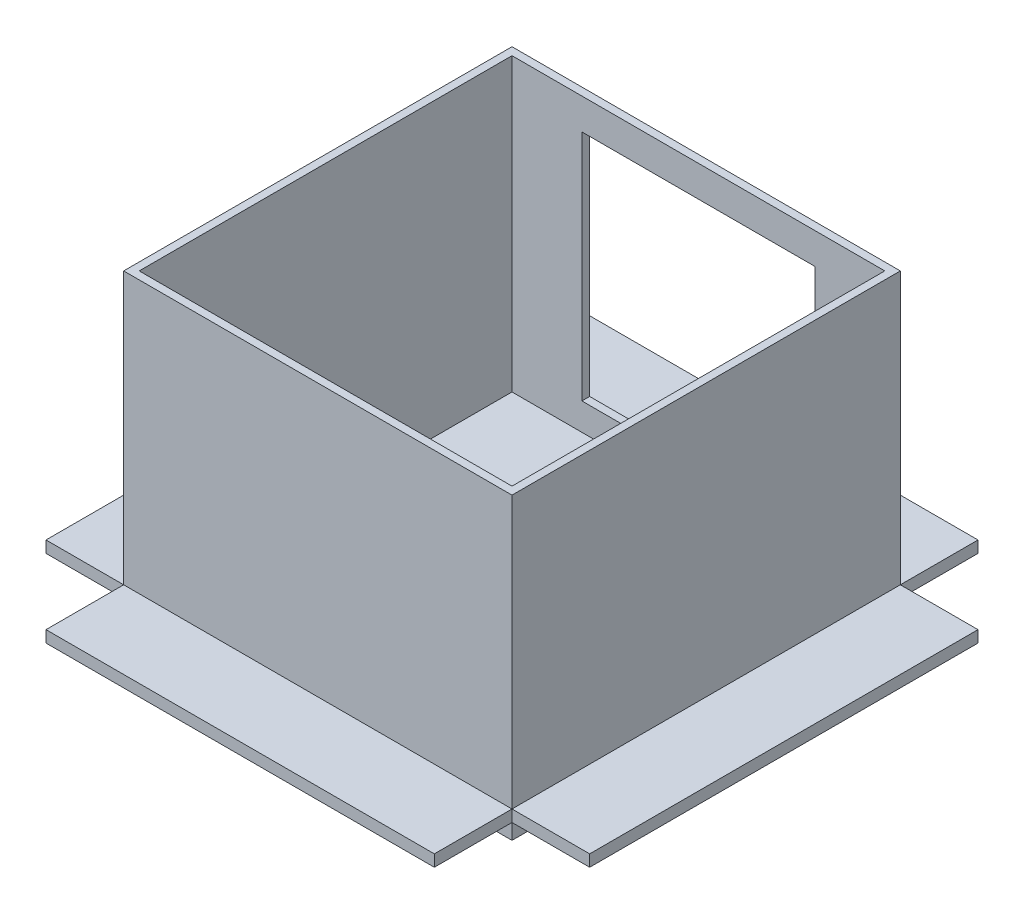
ISO-10303-21;
HEADER;
FILE_DESCRIPTION(('STEP AP214'),'2;1');
FILE_NAME('part.step','',(''),(''),'','','');
FILE_SCHEMA(('AUTOMOTIVE_DESIGN { 1 0 10303 214 1 1 1 1 }'));
ENDSEC;
DATA;
#1=APPLICATION_CONTEXT('core data for automotive mechanical design processes');
#2=APPLICATION_PROTOCOL_DEFINITION('international standard','automotive_design',2000,#1);
#3=PRODUCT_CONTEXT('',#1,'mechanical');
#4=PRODUCT('Part','Part','',(#3));
#5=PRODUCT_RELATED_PRODUCT_CATEGORY('part','',(#4));
#6=PRODUCT_DEFINITION_FORMATION('','',#4);
#7=PRODUCT_DEFINITION_CONTEXT('part definition',#1,'design');
#8=PRODUCT_DEFINITION('design','',#6,#7);
#9=PRODUCT_DEFINITION_SHAPE('','',#8);
#10=(LENGTH_UNIT() NAMED_UNIT(*) SI_UNIT(.MILLI.,.METRE.));
#11=(NAMED_UNIT(*) PLANE_ANGLE_UNIT() SI_UNIT($,.RADIAN.));
#12=(NAMED_UNIT(*) SI_UNIT($,.STERADIAN.) SOLID_ANGLE_UNIT());
#13=UNCERTAINTY_MEASURE_WITH_UNIT(LENGTH_MEASURE(1.E-05),#10,'distance_accuracy_value','');
#14=(GEOMETRIC_REPRESENTATION_CONTEXT(3) GLOBAL_UNCERTAINTY_ASSIGNED_CONTEXT((#13)) GLOBAL_UNIT_ASSIGNED_CONTEXT((#10,
#11,#12)) REPRESENTATION_CONTEXT('',''));
#15=CARTESIAN_POINT('',(0.,0.,0.));
#16=DIRECTION('',(0.,0.,1.));
#17=DIRECTION('',(1.,0.,0.));
#18=AXIS2_PLACEMENT_3D('',#15,#16,#17);
#19=CARTESIAN_POINT('',(50.,-4.,-50.));
#20=DIRECTION('',(0.,0.,-1.));
#21=DIRECTION('',(-1.,0.,0.));
#22=AXIS2_PLACEMENT_3D('',#19,#20,#21);
#23=PLANE('',#22);
#24=DIRECTION('',(0.,1.,0.));
#25=VECTOR('',#24,1.);
#26=CARTESIAN_POINT('',(50.,-4.,-50.));
#27=LINE('',#26,#25);
#28=CARTESIAN_POINT('',(50.,3.,-50.));
#29=VERTEX_POINT('',#28);
#30=CARTESIAN_POINT('',(50.,73.,-50.));
#31=VERTEX_POINT('',#30);
#32=EDGE_CURVE('E335',#29,#31,#27,.T.);
#33=ORIENTED_EDGE('',*,*,#32,.F.);
#34=DIRECTION('',(-1.,0.,0.));
#35=VECTOR('',#34,1.);
#36=CARTESIAN_POINT('',(-154.141421356237,3.,-50.));
#37=LINE('',#36,#35);
#38=CARTESIAN_POINT('',(-50.,3.,-50.));
#39=VERTEX_POINT('',#38);
#40=EDGE_CURVE('E354',#29,#39,#37,.T.);
#41=ORIENTED_EDGE('',*,*,#40,.T.);
#42=DIRECTION('',(0.,1.,0.));
#43=VECTOR('',#42,1.);
#44=CARTESIAN_POINT('',(-50.,-4.,-50.));
#45=LINE('',#44,#43);
#46=CARTESIAN_POINT('',(-50.,73.,-50.));
#47=VERTEX_POINT('',#46);
#48=EDGE_CURVE('E330',#39,#47,#45,.T.);
#49=ORIENTED_EDGE('',*,*,#48,.T.);
#50=DIRECTION('',(-1.,0.,0.));
#51=VECTOR('',#50,1.);
#52=CARTESIAN_POINT('',(50.,73.,-50.));
#53=LINE('',#52,#51);
#54=EDGE_CURVE('E286',#31,#47,#53,.T.);
#55=ORIENTED_EDGE('',*,*,#54,.F.);
#56=EDGE_LOOP('',(#33,#41,#49,#55));
#57=FACE_BOUND('',#56,.T.);
#58=DIRECTION('',(1.,0.,0.));
#59=VECTOR('',#58,1.);
#60=CARTESIAN_POINT('',(-95.0861421152137,5.00000000000002,-50.));
#61=LINE('',#60,#59);
#62=CARTESIAN_POINT('',(-30.,5.00000000000001,-50.));
#63=VERTEX_POINT('',#62);
#64=CARTESIAN_POINT('',(30.,5.,-50.));
#65=VERTEX_POINT('',#64);
#66=EDGE_CURVE('E244',#63,#65,#61,.T.);
#67=ORIENTED_EDGE('',*,*,#66,.T.);
#68=DIRECTION('',(0.,1.,0.));
#69=VECTOR('',#68,1.);
#70=CARTESIAN_POINT('',(30.,38.,-50.));
#71=LINE('',#70,#69);
#72=CARTESIAN_POINT('',(30.,65.,-50.));
#73=VERTEX_POINT('',#72);
#74=EDGE_CURVE('E49',#65,#73,#71,.T.);
#75=ORIENTED_EDGE('',*,*,#74,.T.);
#76=DIRECTION('',(-1.,0.,0.));
#77=VECTOR('',#76,1.);
#78=CARTESIAN_POINT('',(-95.0861421152137,65.,-50.));
#79=LINE('',#78,#77);
#80=CARTESIAN_POINT('',(-30.,65.,-50.));
#81=VERTEX_POINT('',#80);
#82=EDGE_CURVE('E235',#73,#81,#79,.T.);
#83=ORIENTED_EDGE('',*,*,#82,.T.);
#84=DIRECTION('',(0.,-1.,0.));
#85=VECTOR('',#84,1.);
#86=CARTESIAN_POINT('',(-30.,38.,-50.));
#87=LINE('',#86,#85);
#88=EDGE_CURVE('E238',#81,#63,#87,.T.);
#89=ORIENTED_EDGE('',*,*,#88,.T.);
#90=EDGE_LOOP('',(#67,#75,#83,#89));
#91=FACE_BOUND('',#90,.T.);
#92=ADVANCED_FACE('F34',(#57,#91),#23,.T.);
#93=CARTESIAN_POINT('',(50.,-4.,-48.));
#94=DIRECTION('',(0.,0.,-1.));
#95=DIRECTION('',(-1.,0.,0.));
#96=AXIS2_PLACEMENT_3D('',#93,#94,#95);
#97=PLANE('',#96);
#98=DIRECTION('',(0.,1.,0.));
#99=VECTOR('',#98,1.);
#100=CARTESIAN_POINT('',(-48.,-4.,-48.));
#101=LINE('',#100,#99);
#102=CARTESIAN_POINT('',(-48.,-2.,-48.));
#103=VERTEX_POINT('',#102);
#104=CARTESIAN_POINT('',(-48.,73.,-48.));
#105=VERTEX_POINT('',#104);
#106=EDGE_CURVE('E283',#103,#105,#101,.T.);
#107=ORIENTED_EDGE('',*,*,#106,.F.);
#108=DIRECTION('',(-1.,0.,0.));
#109=VECTOR('',#108,1.);
#110=CARTESIAN_POINT('',(-50.,-2.,-48.));
#111=LINE('',#110,#109);
#112=CARTESIAN_POINT('',(48.,-2.,-48.));
#113=VERTEX_POINT('',#112);
#114=EDGE_CURVE('E287',#113,#103,#111,.T.);
#115=ORIENTED_EDGE('',*,*,#114,.F.);
#116=DIRECTION('',(0.,1.,0.));
#117=VECTOR('',#116,1.);
#118=CARTESIAN_POINT('',(48.,-4.,-48.));
#119=LINE('',#118,#117);
#120=CARTESIAN_POINT('',(48.,73.,-48.));
#121=VERTEX_POINT('',#120);
#122=EDGE_CURVE('E278',#113,#121,#119,.T.);
#123=ORIENTED_EDGE('',*,*,#122,.T.);
#124=DIRECTION('',(-1.,0.,0.));
#125=VECTOR('',#124,1.);
#126=CARTESIAN_POINT('',(-50.,73.,-48.));
#127=LINE('',#126,#125);
#128=EDGE_CURVE('E268',#121,#105,#127,.T.);
#129=ORIENTED_EDGE('',*,*,#128,.T.);
#130=EDGE_LOOP('',(#107,#115,#123,#129));
#131=FACE_BOUND('',#130,.T.);
#132=DIRECTION('',(0.,1.,0.));
#133=VECTOR('',#132,1.);
#134=CARTESIAN_POINT('',(30.,38.,-48.));
#135=LINE('',#134,#133);
#136=CARTESIAN_POINT('',(30.,5.,-48.));
#137=VERTEX_POINT('',#136);
#138=CARTESIAN_POINT('',(30.,65.,-48.));
#139=VERTEX_POINT('',#138);
#140=EDGE_CURVE('E227',#137,#139,#135,.T.);
#141=ORIENTED_EDGE('',*,*,#140,.F.);
#142=DIRECTION('',(1.,0.,0.));
#143=VECTOR('',#142,1.);
#144=CARTESIAN_POINT('',(-95.0861421152137,5.00000000000002,-48.));
#145=LINE('',#144,#143);
#146=CARTESIAN_POINT('',(-30.,5.00000000000001,-48.));
#147=VERTEX_POINT('',#146);
#148=EDGE_CURVE('E219',#147,#137,#145,.T.);
#149=ORIENTED_EDGE('',*,*,#148,.F.);
#150=DIRECTION('',(0.,-1.,0.));
#151=VECTOR('',#150,1.);
#152=CARTESIAN_POINT('',(-30.,38.,-48.));
#153=LINE('',#152,#151);
#154=CARTESIAN_POINT('',(-30.,65.,-48.));
#155=VERTEX_POINT('',#154);
#156=EDGE_CURVE('E226',#155,#147,#153,.T.);
#157=ORIENTED_EDGE('',*,*,#156,.F.);
#158=DIRECTION('',(-1.,0.,0.));
#159=VECTOR('',#158,1.);
#160=CARTESIAN_POINT('',(-95.0861421152137,65.,-48.));
#161=LINE('',#160,#159);
#162=EDGE_CURVE('E231',#139,#155,#161,.T.);
#163=ORIENTED_EDGE('',*,*,#162,.F.);
#164=EDGE_LOOP('',(#141,#149,#157,#163));
#165=FACE_BOUND('',#164,.T.);
#166=ADVANCED_FACE('F234',(#131,#165),#97,.F.);
#167=CARTESIAN_POINT('',(-50.,-4.,-50.));
#168=DIRECTION('',(0.,1.,0.));
#169=DIRECTION('',(0.,0.,1.));
#170=AXIS2_PLACEMENT_3D('',#167,#168,#169);
#171=PLANE('',#170);
#172=DIRECTION('',(-1.,0.,0.));
#173=VECTOR('',#172,1.);
#174=CARTESIAN_POINT('',(50.,-4.,-50.));
#175=LINE('',#174,#173);
#176=CARTESIAN_POINT('',(50.,-4.,-50.));
#177=VERTEX_POINT('',#176);
#178=CARTESIAN_POINT('',(-50.,-4.,-50.));
#179=VERTEX_POINT('',#178);
#180=EDGE_CURVE('E318',#177,#179,#175,.T.);
#181=ORIENTED_EDGE('',*,*,#180,.F.);
#182=DIRECTION('',(0.,0.,-1.));
#183=VECTOR('',#182,1.);
#184=CARTESIAN_POINT('',(50.,-4.,50.));
#185=LINE('',#184,#183);
#186=CARTESIAN_POINT('',(50.,-4.,50.));
#187=VERTEX_POINT('',#186);
#188=EDGE_CURVE('E327',#187,#177,#185,.T.);
#189=ORIENTED_EDGE('',*,*,#188,.F.);
#190=DIRECTION('',(1.,0.,0.));
#191=VECTOR('',#190,1.);
#192=CARTESIAN_POINT('',(-50.,-4.,50.));
#193=LINE('',#192,#191);
#194=CARTESIAN_POINT('',(-50.,-4.,50.));
#195=VERTEX_POINT('',#194);
#196=EDGE_CURVE('E324',#195,#187,#193,.T.);
#197=ORIENTED_EDGE('',*,*,#196,.F.);
#198=DIRECTION('',(0.,0.,1.));
#199=VECTOR('',#198,1.);
#200=CARTESIAN_POINT('',(-50.,-4.,-50.));
#201=LINE('',#200,#199);
#202=EDGE_CURVE('E321',#179,#195,#201,.T.);
#203=ORIENTED_EDGE('',*,*,#202,.F.);
#204=EDGE_LOOP('',(#181,#189,#197,#203));
#205=FACE_BOUND('',#204,.T.);
#206=DIRECTION('',(0.,0.,1.));
#207=VECTOR('',#206,1.);
#208=CARTESIAN_POINT('',(-40.,-4.,-110.141421356237));
#209=LINE('',#208,#207);
#210=CARTESIAN_POINT('',(-40.,-4.,30.));
#211=VERTEX_POINT('',#210);
#212=CARTESIAN_POINT('',(-40.,-4.,40.));
#213=VERTEX_POINT('',#212);
#214=EDGE_CURVE('E250',#211,#213,#209,.T.);
#215=ORIENTED_EDGE('',*,*,#214,.T.);
#216=DIRECTION('',(1.,0.,0.));
#217=VECTOR('',#216,1.);
#218=CARTESIAN_POINT('',(0.,-4.,40.));
#219=LINE('',#218,#217);
#220=CARTESIAN_POINT('',(40.,-4.,40.));
#221=VERTEX_POINT('',#220);
#222=EDGE_CURVE('E262',#213,#221,#219,.T.);
#223=ORIENTED_EDGE('',*,*,#222,.T.);
#224=DIRECTION('',(0.,0.,-1.));
#225=VECTOR('',#224,1.);
#226=CARTESIAN_POINT('',(40.0000000000001,-4.,-110.141421356237));
#227=LINE('',#226,#225);
#228=CARTESIAN_POINT('',(40.,-4.,30.));
#229=VERTEX_POINT('',#228);
#230=EDGE_CURVE('E259',#221,#229,#227,.T.);
#231=ORIENTED_EDGE('',*,*,#230,.T.);
#232=DIRECTION('',(-1.,0.,0.));
#233=VECTOR('',#232,1.);
#234=CARTESIAN_POINT('',(0.,-4.,30.));
#235=LINE('',#234,#233);
#236=EDGE_CURVE('E256',#229,#211,#235,.T.);
#237=ORIENTED_EDGE('',*,*,#236,.T.);
#238=EDGE_LOOP('',(#215,#223,#231,#237));
#239=FACE_BOUND('',#238,.T.);
#240=ADVANCED_FACE('F484',(#205,#239),#171,.F.);
#241=CARTESIAN_POINT('',(-50.,-2.,-50.));
#242=DIRECTION('',(0.,1.,0.));
#243=DIRECTION('',(0.,0.,1.));
#244=AXIS2_PLACEMENT_3D('',#241,#242,#243);
#245=PLANE('',#244);
#246=ORIENTED_EDGE('',*,*,#114,.T.);
#247=DIRECTION('',(0.,0.,1.));
#248=VECTOR('',#247,1.);
#249=CARTESIAN_POINT('',(-48.,-2.,-50.));
#250=LINE('',#249,#248);
#251=CARTESIAN_POINT('',(-48.,-2.,48.));
#252=VERTEX_POINT('',#251);
#253=EDGE_CURVE('E290',#103,#252,#250,.T.);
#254=ORIENTED_EDGE('',*,*,#253,.T.);
#255=DIRECTION('',(1.,0.,0.));
#256=VECTOR('',#255,1.);
#257=CARTESIAN_POINT('',(-50.,-2.,48.));
#258=LINE('',#257,#256);
#259=CARTESIAN_POINT('',(48.,-2.,48.));
#260=VERTEX_POINT('',#259);
#261=EDGE_CURVE('E284',#252,#260,#258,.T.);
#262=ORIENTED_EDGE('',*,*,#261,.T.);
#263=DIRECTION('',(0.,0.,-1.));
#264=VECTOR('',#263,1.);
#265=CARTESIAN_POINT('',(48.,-2.,-50.));
#266=LINE('',#265,#264);
#267=EDGE_CURVE('E280',#260,#113,#266,.T.);
#268=ORIENTED_EDGE('',*,*,#267,.T.);
#269=EDGE_LOOP('',(#246,#254,#262,#268));
#270=FACE_BOUND('',#269,.T.);
#271=DIRECTION('',(-1.,0.,0.));
#272=VECTOR('',#271,1.);
#273=CARTESIAN_POINT('',(-50.,-2.,40.));
#274=LINE('',#273,#272);
#275=CARTESIAN_POINT('',(40.,-2.,40.));
#276=VERTEX_POINT('',#275);
#277=CARTESIAN_POINT('',(-40.,-2.,40.));
#278=VERTEX_POINT('',#277);
#279=EDGE_CURVE('E42',#276,#278,#274,.T.);
#280=ORIENTED_EDGE('',*,*,#279,.T.);
#281=DIRECTION('',(0.,0.,-1.));
#282=VECTOR('',#281,1.);
#283=CARTESIAN_POINT('',(-40.,-2.,-50.));
#284=LINE('',#283,#282);
#285=CARTESIAN_POINT('',(-40.,-2.,30.));
#286=VERTEX_POINT('',#285);
#287=EDGE_CURVE('E11',#278,#286,#284,.T.);
#288=ORIENTED_EDGE('',*,*,#287,.T.);
#289=DIRECTION('',(1.,0.,0.));
#290=VECTOR('',#289,1.);
#291=CARTESIAN_POINT('',(-50.,-2.,30.));
#292=LINE('',#291,#290);
#293=CARTESIAN_POINT('',(40.,-2.,30.));
#294=VERTEX_POINT('',#293);
#295=EDGE_CURVE('E465',#286,#294,#292,.T.);
#296=ORIENTED_EDGE('',*,*,#295,.T.);
#297=DIRECTION('',(0.,0.,1.));
#298=VECTOR('',#297,1.);
#299=CARTESIAN_POINT('',(40.0000000000001,-2.,-49.9999999999999));
#300=LINE('',#299,#298);
#301=EDGE_CURVE('E468',#294,#276,#300,.T.);
#302=ORIENTED_EDGE('',*,*,#301,.T.);
#303=EDGE_LOOP('',(#280,#288,#296,#302));
#304=FACE_BOUND('',#303,.T.);
#305=ADVANCED_FACE('F472',(#270,#304),#245,.T.);
#306=CARTESIAN_POINT('',(-154.141421356237,3.,0.));
#307=DIRECTION('',(0.,1.,0.));
#308=DIRECTION('',(0.,0.,1.));
#309=AXIS2_PLACEMENT_3D('',#306,#307,#308);
#310=PLANE('',#309);
#311=ORIENTED_EDGE('',*,*,#40,.F.);
#312=DIRECTION('',(0.,0.,-1.));
#313=VECTOR('',#312,1.);
#314=CARTESIAN_POINT('',(50.,3.,0.));
#315=LINE('',#314,#313);
#316=CARTESIAN_POINT('',(50.,3.,-70.));
#317=VERTEX_POINT('',#316);
#318=EDGE_CURVE('E378',#29,#317,#315,.T.);
#319=ORIENTED_EDGE('',*,*,#318,.T.);
#320=DIRECTION('',(1.,0.,0.));
#321=VECTOR('',#320,1.);
#322=CARTESIAN_POINT('',(-154.141421356237,3.,-70.));
#323=LINE('',#322,#321);
#324=CARTESIAN_POINT('',(-50.,3.,-70.));
#325=VERTEX_POINT('',#324);
#326=EDGE_CURVE('E380',#325,#317,#323,.T.);
#327=ORIENTED_EDGE('',*,*,#326,.F.);
#328=DIRECTION('',(0.,0.,-1.));
#329=VECTOR('',#328,1.);
#330=CARTESIAN_POINT('',(-50.,3.,0.));
#331=LINE('',#330,#329);
#332=EDGE_CURVE('E383',#39,#325,#331,.T.);
#333=ORIENTED_EDGE('',*,*,#332,.F.);
#334=EDGE_LOOP('',(#311,#319,#327,#333));
#335=FACE_BOUND('',#334,.T.);
#336=ADVANCED_FACE('F598',(#335),#310,.T.);
#337=DIRECTION('',(0.,0.,-1.));
#338=VECTOR('',#337,1.);
#339=CARTESIAN_POINT('',(50.,3.,0.));
#340=LINE('',#339,#338);
#341=CARTESIAN_POINT('',(50.,3.,50.));
#342=VERTEX_POINT('',#341);
#343=EDGE_CURVE('E351',#342,#29,#340,.T.);
#344=ORIENTED_EDGE('',*,*,#343,.F.);
#345=DIRECTION('',(1.,0.,0.));
#346=VECTOR('',#345,1.);
#347=CARTESIAN_POINT('',(-154.141421356237,3.,50.));
#348=LINE('',#347,#346);
#349=CARTESIAN_POINT('',(70.,3.,50.));
#350=VERTEX_POINT('',#349);
#351=EDGE_CURVE('E370',#342,#350,#348,.T.);
#352=ORIENTED_EDGE('',*,*,#351,.T.);
#353=DIRECTION('',(0.,0.,1.));
#354=VECTOR('',#353,1.);
#355=CARTESIAN_POINT('',(70.,3.,0.));
#356=LINE('',#355,#354);
#357=CARTESIAN_POINT('',(70.,3.,-50.));
#358=VERTEX_POINT('',#357);
#359=EDGE_CURVE('E372',#358,#350,#356,.T.);
#360=ORIENTED_EDGE('',*,*,#359,.F.);
#361=DIRECTION('',(1.,0.,0.));
#362=VECTOR('',#361,1.);
#363=CARTESIAN_POINT('',(-154.141421356237,3.,-50.));
#364=LINE('',#363,#362);
#365=EDGE_CURVE('E375',#29,#358,#364,.T.);
#366=ORIENTED_EDGE('',*,*,#365,.F.);
#367=EDGE_LOOP('',(#344,#352,#360,#366));
#368=FACE_BOUND('',#367,.T.);
#369=ADVANCED_FACE('F656',(#368),#310,.T.);
#370=DIRECTION('',(1.,0.,0.));
#371=VECTOR('',#370,1.);
#372=CARTESIAN_POINT('',(-154.141421356237,3.,50.));
#373=LINE('',#372,#371);
#374=CARTESIAN_POINT('',(-50.,3.,50.));
#375=VERTEX_POINT('',#374);
#376=EDGE_CURVE('E348',#375,#342,#373,.T.);
#377=ORIENTED_EDGE('',*,*,#376,.F.);
#378=DIRECTION('',(0.,0.,1.));
#379=VECTOR('',#378,1.);
#380=CARTESIAN_POINT('',(-50.,3.,0.));
#381=LINE('',#380,#379);
#382=CARTESIAN_POINT('',(-50.,3.,70.));
#383=VERTEX_POINT('',#382);
#384=EDGE_CURVE('E361',#375,#383,#381,.T.);
#385=ORIENTED_EDGE('',*,*,#384,.T.);
#386=DIRECTION('',(-1.,0.,0.));
#387=VECTOR('',#386,1.);
#388=CARTESIAN_POINT('',(-154.141421356237,3.,70.0000000000001));
#389=LINE('',#388,#387);
#390=CARTESIAN_POINT('',(50.,3.,70.));
#391=VERTEX_POINT('',#390);
#392=EDGE_CURVE('E364',#391,#383,#389,.T.);
#393=ORIENTED_EDGE('',*,*,#392,.F.);
#394=DIRECTION('',(0.,0.,1.));
#395=VECTOR('',#394,1.);
#396=CARTESIAN_POINT('',(50.,3.,0.));
#397=LINE('',#396,#395);
#398=EDGE_CURVE('E367',#342,#391,#397,.T.);
#399=ORIENTED_EDGE('',*,*,#398,.F.);
#400=EDGE_LOOP('',(#377,#385,#393,#399));
#401=FACE_BOUND('',#400,.T.);
#402=ADVANCED_FACE('F580',(#401),#310,.T.);
#403=CARTESIAN_POINT('',(-154.141421356237,0.,0.));
#404=DIRECTION('',(0.,1.,0.));
#405=DIRECTION('',(0.,0.,1.));
#406=AXIS2_PLACEMENT_3D('',#403,#404,#405);
#407=PLANE('',#406);
#408=DIRECTION('',(0.,0.,-1.));
#409=VECTOR('',#408,1.);
#410=CARTESIAN_POINT('',(50.,0.,0.));
#411=LINE('',#410,#409);
#412=CARTESIAN_POINT('',(50.,0.,-50.));
#413=VERTEX_POINT('',#412);
#414=CARTESIAN_POINT('',(50.,0.,-70.));
#415=VERTEX_POINT('',#414);
#416=EDGE_CURVE('E412',#413,#415,#411,.T.);
#417=ORIENTED_EDGE('',*,*,#416,.F.);
#418=DIRECTION('',(-1.,0.,0.));
#419=VECTOR('',#418,1.);
#420=CARTESIAN_POINT('',(-154.141421356237,0.,-50.));
#421=LINE('',#420,#419);
#422=CARTESIAN_POINT('',(-50.,0.,-50.));
#423=VERTEX_POINT('',#422);
#424=EDGE_CURVE('E462',#413,#423,#421,.T.);
#425=ORIENTED_EDGE('',*,*,#424,.T.);
#426=DIRECTION('',(0.,0.,-1.));
#427=VECTOR('',#426,1.);
#428=CARTESIAN_POINT('',(-50.,0.,0.));
#429=LINE('',#428,#427);
#430=CARTESIAN_POINT('',(-50.,0.,-70.));
#431=VERTEX_POINT('',#430);
#432=EDGE_CURVE('E418',#423,#431,#429,.T.);
#433=ORIENTED_EDGE('',*,*,#432,.T.);
#434=DIRECTION('',(1.,0.,0.));
#435=VECTOR('',#434,1.);
#436=CARTESIAN_POINT('',(-154.141421356237,0.,-70.));
#437=LINE('',#436,#435);
#438=EDGE_CURVE('E415',#431,#415,#437,.T.);
#439=ORIENTED_EDGE('',*,*,#438,.T.);
#440=EDGE_LOOP('',(#417,#425,#433,#439));
#441=FACE_BOUND('',#440,.T.);
#442=ADVANCED_FACE('F542',(#441),#407,.F.);
#443=DIRECTION('',(1.,0.,0.));
#444=VECTOR('',#443,1.);
#445=CARTESIAN_POINT('',(-154.141421356237,0.,50.));
#446=LINE('',#445,#444);
#447=CARTESIAN_POINT('',(50.,0.,50.));
#448=VERTEX_POINT('',#447);
#449=CARTESIAN_POINT('',(70.,0.,50.));
#450=VERTEX_POINT('',#449);
#451=EDGE_CURVE('E403',#448,#450,#446,.T.);
#452=ORIENTED_EDGE('',*,*,#451,.F.);
#453=DIRECTION('',(0.,0.,-1.));
#454=VECTOR('',#453,1.);
#455=CARTESIAN_POINT('',(50.,0.,0.));
#456=LINE('',#455,#454);
#457=EDGE_CURVE('E459',#448,#413,#456,.T.);
#458=ORIENTED_EDGE('',*,*,#457,.T.);
#459=DIRECTION('',(1.,0.,0.));
#460=VECTOR('',#459,1.);
#461=CARTESIAN_POINT('',(-154.141421356237,0.,-50.));
#462=LINE('',#461,#460);
#463=CARTESIAN_POINT('',(70.,0.,-50.));
#464=VERTEX_POINT('',#463);
#465=EDGE_CURVE('E409',#413,#464,#462,.T.);
#466=ORIENTED_EDGE('',*,*,#465,.T.);
#467=DIRECTION('',(0.,0.,1.));
#468=VECTOR('',#467,1.);
#469=CARTESIAN_POINT('',(70.,0.,0.));
#470=LINE('',#469,#468);
#471=EDGE_CURVE('E406',#464,#450,#470,.T.);
#472=ORIENTED_EDGE('',*,*,#471,.T.);
#473=EDGE_LOOP('',(#452,#458,#466,#472));
#474=FACE_BOUND('',#473,.T.);
#475=ADVANCED_FACE('F532',(#474),#407,.F.);
#476=DIRECTION('',(0.,0.,1.));
#477=VECTOR('',#476,1.);
#478=CARTESIAN_POINT('',(-50.,0.,0.));
#479=LINE('',#478,#477);
#480=CARTESIAN_POINT('',(-50.,0.,50.));
#481=VERTEX_POINT('',#480);
#482=CARTESIAN_POINT('',(-50.,0.,70.));
#483=VERTEX_POINT('',#482);
#484=EDGE_CURVE('E394',#481,#483,#479,.T.);
#485=ORIENTED_EDGE('',*,*,#484,.F.);
#486=DIRECTION('',(1.,0.,0.));
#487=VECTOR('',#486,1.);
#488=CARTESIAN_POINT('',(-154.141421356237,0.,50.));
#489=LINE('',#488,#487);
#490=EDGE_CURVE('E456',#481,#448,#489,.T.);
#491=ORIENTED_EDGE('',*,*,#490,.T.);
#492=DIRECTION('',(0.,0.,1.));
#493=VECTOR('',#492,1.);
#494=CARTESIAN_POINT('',(50.,0.,0.));
#495=LINE('',#494,#493);
#496=CARTESIAN_POINT('',(50.,0.,70.));
#497=VERTEX_POINT('',#496);
#498=EDGE_CURVE('E400',#448,#497,#495,.T.);
#499=ORIENTED_EDGE('',*,*,#498,.T.);
#500=DIRECTION('',(-1.,0.,0.));
#501=VECTOR('',#500,1.);
#502=CARTESIAN_POINT('',(-154.141421356237,0.,70.0000000000001));
#503=LINE('',#502,#501);
#504=EDGE_CURVE('E397',#497,#483,#503,.T.);
#505=ORIENTED_EDGE('',*,*,#504,.T.);
#506=EDGE_LOOP('',(#485,#491,#499,#505));
#507=FACE_BOUND('',#506,.T.);
#508=ADVANCED_FACE('F560',(#507),#407,.F.);
#509=CARTESIAN_POINT('',(-154.141421356237,3.,50.));
#510=DIRECTION('',(0.,0.,1.));
#511=DIRECTION('',(1.,0.,0.));
#512=AXIS2_PLACEMENT_3D('',#509,#510,#511);
#513=PLANE('',#512);
#514=DIRECTION('',(-1.,0.,0.));
#515=VECTOR('',#514,1.);
#516=CARTESIAN_POINT('',(-154.141421356237,0.,50.));
#517=LINE('',#516,#515);
#518=CARTESIAN_POINT('',(-70.,0.,50.));
#519=VERTEX_POINT('',#518);
#520=EDGE_CURVE('E357',#481,#519,#517,.T.);
#521=ORIENTED_EDGE('',*,*,#520,.F.);
#522=DIRECTION('',(0.,-1.,0.));
#523=VECTOR('',#522,1.);
#524=CARTESIAN_POINT('',(-50.,3.,50.));
#525=LINE('',#524,#523);
#526=EDGE_CURVE('E450',#375,#481,#525,.T.);
#527=ORIENTED_EDGE('',*,*,#526,.F.);
#528=DIRECTION('',(-1.,0.,0.));
#529=VECTOR('',#528,1.);
#530=CARTESIAN_POINT('',(-154.141421356237,3.,50.));
#531=LINE('',#530,#529);
#532=CARTESIAN_POINT('',(-70.,3.,50.));
#533=VERTEX_POINT('',#532);
#534=EDGE_CURVE('E358',#375,#533,#531,.T.);
#535=ORIENTED_EDGE('',*,*,#534,.T.);
#536=DIRECTION('',(0.,-1.,0.));
#537=VECTOR('',#536,1.);
#538=CARTESIAN_POINT('',(-70.,3.,50.));
#539=LINE('',#538,#537);
#540=EDGE_CURVE('E391',#533,#519,#539,.T.);
#541=ORIENTED_EDGE('',*,*,#540,.T.);
#542=EDGE_LOOP('',(#521,#527,#535,#541));
#543=FACE_BOUND('',#542,.T.);
#544=ADVANCED_FACE('F36',(#543),#513,.T.);
#545=CARTESIAN_POINT('',(-50.,3.,0.));
#546=DIRECTION('',(1.,0.,0.));
#547=DIRECTION('',(0.,0.,-1.));
#548=AXIS2_PLACEMENT_3D('',#545,#546,#547);
#549=PLANE('',#548);
#550=ORIENTED_EDGE('',*,*,#484,.T.);
#551=DIRECTION('',(0.,-1.,0.));
#552=VECTOR('',#551,1.);
#553=CARTESIAN_POINT('',(-50.,3.,70.));
#554=LINE('',#553,#552);
#555=EDGE_CURVE('E448',#383,#483,#554,.T.);
#556=ORIENTED_EDGE('',*,*,#555,.F.);
#557=ORIENTED_EDGE('',*,*,#384,.F.);
#558=ORIENTED_EDGE('',*,*,#526,.T.);
#559=EDGE_LOOP('',(#550,#556,#557,#558));
#560=FACE_BOUND('',#559,.T.);
#561=ADVANCED_FACE('F574',(#560),#549,.F.);
#562=CARTESIAN_POINT('',(-154.141421356237,3.,70.0000000000001));
#563=DIRECTION('',(0.,0.,1.));
#564=DIRECTION('',(1.,0.,0.));
#565=AXIS2_PLACEMENT_3D('',#562,#563,#564);
#566=PLANE('',#565);
#567=ORIENTED_EDGE('',*,*,#504,.F.);
#568=DIRECTION('',(0.,-1.,0.));
#569=VECTOR('',#568,1.);
#570=CARTESIAN_POINT('',(50.,3.,70.));
#571=LINE('',#570,#569);
#572=EDGE_CURVE('E446',#391,#497,#571,.T.);
#573=ORIENTED_EDGE('',*,*,#572,.F.);
#574=ORIENTED_EDGE('',*,*,#392,.T.);
#575=ORIENTED_EDGE('',*,*,#555,.T.);
#576=EDGE_LOOP('',(#567,#573,#574,#575));
#577=FACE_BOUND('',#576,.T.);
#578=ADVANCED_FACE('F634',(#577),#566,.T.);
#579=CARTESIAN_POINT('',(50.,3.,0.));
#580=DIRECTION('',(1.,0.,0.));
#581=DIRECTION('',(0.,0.,-1.));
#582=AXIS2_PLACEMENT_3D('',#579,#580,#581);
#583=PLANE('',#582);
#584=ORIENTED_EDGE('',*,*,#498,.F.);
#585=DIRECTION('',(0.,-1.,0.));
#586=VECTOR('',#585,1.);
#587=CARTESIAN_POINT('',(50.,3.,50.));
#588=LINE('',#587,#586);
#589=EDGE_CURVE('E443',#342,#448,#588,.T.);
#590=ORIENTED_EDGE('',*,*,#589,.F.);
#591=ORIENTED_EDGE('',*,*,#398,.T.);
#592=ORIENTED_EDGE('',*,*,#572,.T.);
#593=EDGE_LOOP('',(#584,#590,#591,#592));
#594=FACE_BOUND('',#593,.T.);
#595=ADVANCED_FACE('F556',(#594),#583,.T.);
#596=CARTESIAN_POINT('',(-154.141421356237,3.,50.));
#597=DIRECTION('',(0.,0.,-1.));
#598=DIRECTION('',(-1.,0.,0.));
#599=AXIS2_PLACEMENT_3D('',#596,#597,#598);
#600=PLANE('',#599);
#601=ORIENTED_EDGE('',*,*,#451,.T.);
#602=DIRECTION('',(0.,-1.,0.));
#603=VECTOR('',#602,1.);
#604=CARTESIAN_POINT('',(70.,3.,50.));
#605=LINE('',#604,#603);
#606=EDGE_CURVE('E441',#350,#450,#605,.T.);
#607=ORIENTED_EDGE('',*,*,#606,.F.);
#608=ORIENTED_EDGE('',*,*,#351,.F.);
#609=ORIENTED_EDGE('',*,*,#589,.T.);
#610=EDGE_LOOP('',(#601,#607,#608,#609));
#611=FACE_BOUND('',#610,.T.);
#612=ADVANCED_FACE('F552',(#611),#600,.F.);
#613=CARTESIAN_POINT('',(70.,3.,0.));
#614=DIRECTION('',(1.,0.,0.));
#615=DIRECTION('',(0.,0.,-1.));
#616=AXIS2_PLACEMENT_3D('',#613,#614,#615);
#617=PLANE('',#616);
#618=ORIENTED_EDGE('',*,*,#471,.F.);
#619=DIRECTION('',(0.,-1.,0.));
#620=VECTOR('',#619,1.);
#621=CARTESIAN_POINT('',(70.,3.,-50.));
#622=LINE('',#621,#620);
#623=EDGE_CURVE('E439',#358,#464,#622,.T.);
#624=ORIENTED_EDGE('',*,*,#623,.F.);
#625=ORIENTED_EDGE('',*,*,#359,.T.);
#626=ORIENTED_EDGE('',*,*,#606,.T.);
#627=EDGE_LOOP('',(#618,#624,#625,#626));
#628=FACE_BOUND('',#627,.T.);
#629=ADVANCED_FACE('F548',(#628),#617,.T.);
#630=CARTESIAN_POINT('',(-154.141421356237,3.,-50.));
#631=DIRECTION('',(0.,0.,-1.));
#632=DIRECTION('',(-1.,0.,0.));
#633=AXIS2_PLACEMENT_3D('',#630,#631,#632);
#634=PLANE('',#633);
#635=ORIENTED_EDGE('',*,*,#465,.F.);
#636=DIRECTION('',(0.,-1.,0.));
#637=VECTOR('',#636,1.);
#638=CARTESIAN_POINT('',(50.,3.,-50.));
#639=LINE('',#638,#637);
#640=EDGE_CURVE('E436',#29,#413,#639,.T.);
#641=ORIENTED_EDGE('',*,*,#640,.F.);
#642=ORIENTED_EDGE('',*,*,#365,.T.);
#643=ORIENTED_EDGE('',*,*,#623,.T.);
#644=EDGE_LOOP('',(#635,#641,#642,#643));
#645=FACE_BOUND('',#644,.T.);
#646=ADVANCED_FACE('F544',(#645),#634,.T.);
#647=CARTESIAN_POINT('',(50.,3.,0.));
#648=DIRECTION('',(-1.,0.,0.));
#649=DIRECTION('',(0.,0.,1.));
#650=AXIS2_PLACEMENT_3D('',#647,#648,#649);
#651=PLANE('',#650);
#652=ORIENTED_EDGE('',*,*,#416,.T.);
#653=DIRECTION('',(0.,-1.,0.));
#654=VECTOR('',#653,1.);
#655=CARTESIAN_POINT('',(50.,3.,-70.));
#656=LINE('',#655,#654);
#657=EDGE_CURVE('E434',#317,#415,#656,.T.);
#658=ORIENTED_EDGE('',*,*,#657,.F.);
#659=ORIENTED_EDGE('',*,*,#318,.F.);
#660=ORIENTED_EDGE('',*,*,#640,.T.);
#661=EDGE_LOOP('',(#652,#658,#659,#660));
#662=FACE_BOUND('',#661,.T.);
#663=ADVANCED_FACE('F538',(#662),#651,.F.);
#664=CARTESIAN_POINT('',(-154.141421356237,3.,-70.));
#665=DIRECTION('',(0.,0.,-1.));
#666=DIRECTION('',(-1.,0.,0.));
#667=AXIS2_PLACEMENT_3D('',#664,#665,#666);
#668=PLANE('',#667);
#669=ORIENTED_EDGE('',*,*,#438,.F.);
#670=DIRECTION('',(0.,-1.,0.));
#671=VECTOR('',#670,1.);
#672=CARTESIAN_POINT('',(-50.,3.,-70.));
#673=LINE('',#672,#671);
#674=EDGE_CURVE('E432',#325,#431,#673,.T.);
#675=ORIENTED_EDGE('',*,*,#674,.F.);
#676=ORIENTED_EDGE('',*,*,#326,.T.);
#677=ORIENTED_EDGE('',*,*,#657,.T.);
#678=EDGE_LOOP('',(#669,#675,#676,#677));
#679=FACE_BOUND('',#678,.T.);
#680=ADVANCED_FACE('F620',(#679),#668,.T.);
#681=CARTESIAN_POINT('',(-50.,3.,0.));
#682=DIRECTION('',(-1.,0.,0.));
#683=DIRECTION('',(0.,0.,1.));
#684=AXIS2_PLACEMENT_3D('',#681,#682,#683);
#685=PLANE('',#684);
#686=ORIENTED_EDGE('',*,*,#432,.F.);
#687=DIRECTION('',(0.,-1.,0.));
#688=VECTOR('',#687,1.);
#689=CARTESIAN_POINT('',(-50.,3.,-50.));
#690=LINE('',#689,#688);
#691=EDGE_CURVE('E429',#39,#423,#690,.T.);
#692=ORIENTED_EDGE('',*,*,#691,.F.);
#693=ORIENTED_EDGE('',*,*,#332,.T.);
#694=ORIENTED_EDGE('',*,*,#674,.T.);
#695=EDGE_LOOP('',(#686,#692,#693,#694));
#696=FACE_BOUND('',#695,.T.);
#697=ADVANCED_FACE('F601',(#696),#685,.T.);
#698=CARTESIAN_POINT('',(-154.141421356237,3.,-50.));
#699=DIRECTION('',(0.,0.,1.));
#700=DIRECTION('',(1.,0.,0.));
#701=AXIS2_PLACEMENT_3D('',#698,#699,#700);
#702=PLANE('',#701);
#703=DIRECTION('',(-1.,0.,0.));
#704=VECTOR('',#703,1.);
#705=CARTESIAN_POINT('',(-154.141421356237,0.,-50.));
#706=LINE('',#705,#704);
#707=CARTESIAN_POINT('',(-70.,0.,-50.));
#708=VERTEX_POINT('',#707);
#709=EDGE_CURVE('E421',#423,#708,#706,.T.);
#710=ORIENTED_EDGE('',*,*,#709,.T.);
#711=DIRECTION('',(0.,-1.,0.));
#712=VECTOR('',#711,1.);
#713=CARTESIAN_POINT('',(-70.,3.,-50.));
#714=LINE('',#713,#712);
#715=CARTESIAN_POINT('',(-70.,3.,-50.));
#716=VERTEX_POINT('',#715);
#717=EDGE_CURVE('E427',#716,#708,#714,.T.);
#718=ORIENTED_EDGE('',*,*,#717,.F.);
#719=DIRECTION('',(-1.,0.,0.));
#720=VECTOR('',#719,1.);
#721=CARTESIAN_POINT('',(-154.141421356237,3.,-50.));
#722=LINE('',#721,#720);
#723=EDGE_CURVE('E386',#39,#716,#722,.T.);
#724=ORIENTED_EDGE('',*,*,#723,.F.);
#725=ORIENTED_EDGE('',*,*,#691,.T.);
#726=EDGE_LOOP('',(#710,#718,#724,#725));
#727=FACE_BOUND('',#726,.T.);
#728=ADVANCED_FACE('F605',(#727),#702,.F.);
#729=CARTESIAN_POINT('',(-70.,3.,0.));
#730=DIRECTION('',(-1.,0.,0.));
#731=DIRECTION('',(0.,0.,1.));
#732=AXIS2_PLACEMENT_3D('',#729,#730,#731);
#733=PLANE('',#732);
#734=DIRECTION('',(0.,0.,-1.));
#735=VECTOR('',#734,1.);
#736=CARTESIAN_POINT('',(-70.,0.,0.));
#737=LINE('',#736,#735);
#738=EDGE_CURVE('E362',#519,#708,#737,.T.);
#739=ORIENTED_EDGE('',*,*,#738,.F.);
#740=ORIENTED_EDGE('',*,*,#540,.F.);
#741=DIRECTION('',(0.,0.,-1.));
#742=VECTOR('',#741,1.);
#743=CARTESIAN_POINT('',(-70.,3.,0.));
#744=LINE('',#743,#742);
#745=EDGE_CURVE('E388',#533,#716,#744,.T.);
#746=ORIENTED_EDGE('',*,*,#745,.T.);
#747=ORIENTED_EDGE('',*,*,#717,.T.);
#748=EDGE_LOOP('',(#739,#740,#746,#747));
#749=FACE_BOUND('',#748,.T.);
#750=ADVANCED_FACE('F608',(#749),#733,.T.);
#751=DIRECTION('',(0.,0.,1.));
#752=VECTOR('',#751,1.);
#753=CARTESIAN_POINT('',(-50.,3.,0.));
#754=LINE('',#753,#752);
#755=EDGE_CURVE('E334',#39,#375,#754,.T.);
#756=ORIENTED_EDGE('',*,*,#755,.F.);
#757=ORIENTED_EDGE('',*,*,#723,.T.);
#758=ORIENTED_EDGE('',*,*,#745,.F.);
#759=ORIENTED_EDGE('',*,*,#534,.F.);
#760=EDGE_LOOP('',(#756,#757,#758,#759));
#761=FACE_BOUND('',#760,.T.);
#762=ADVANCED_FACE('F606',(#761),#310,.T.);
#763=ORIENTED_EDGE('',*,*,#709,.F.);
#764=DIRECTION('',(0.,0.,1.));
#765=VECTOR('',#764,1.);
#766=CARTESIAN_POINT('',(-50.,0.,0.));
#767=LINE('',#766,#765);
#768=EDGE_CURVE('E453',#423,#481,#767,.T.);
#769=ORIENTED_EDGE('',*,*,#768,.T.);
#770=ORIENTED_EDGE('',*,*,#520,.T.);
#771=ORIENTED_EDGE('',*,*,#738,.T.);
#772=EDGE_LOOP('',(#763,#769,#770,#771));
#773=FACE_BOUND('',#772,.T.);
#774=ADVANCED_FACE('F567',(#773),#407,.F.);
#775=CARTESIAN_POINT('',(-50.,-4.,-50.));
#776=DIRECTION('',(-1.,0.,0.));
#777=DIRECTION('',(0.,0.,1.));
#778=AXIS2_PLACEMENT_3D('',#775,#776,#777);
#779=PLANE('',#778);
#780=ORIENTED_EDGE('',*,*,#768,.F.);
#781=EDGE_CURVE('E343',#179,#423,#45,.T.);
#782=ORIENTED_EDGE('',*,*,#781,.F.);
#783=ORIENTED_EDGE('',*,*,#202,.T.);
#784=DIRECTION('',(0.,1.,0.));
#785=VECTOR('',#784,1.);
#786=CARTESIAN_POINT('',(-50.,-4.,50.));
#787=LINE('',#786,#785);
#788=EDGE_CURVE('E340',#195,#481,#787,.T.);
#789=ORIENTED_EDGE('',*,*,#788,.T.);
#790=EDGE_LOOP('',(#780,#782,#783,#789));
#791=FACE_BOUND('',#790,.T.);
#792=ADVANCED_FACE('F648',(#791),#779,.T.);
#793=CARTESIAN_POINT('',(-50.,-4.,50.));
#794=DIRECTION('',(0.,0.,1.));
#795=DIRECTION('',(1.,0.,0.));
#796=AXIS2_PLACEMENT_3D('',#793,#794,#795);
#797=PLANE('',#796);
#798=ORIENTED_EDGE('',*,*,#490,.F.);
#799=ORIENTED_EDGE('',*,*,#788,.F.);
#800=ORIENTED_EDGE('',*,*,#196,.T.);
#801=DIRECTION('',(0.,1.,0.));
#802=VECTOR('',#801,1.);
#803=CARTESIAN_POINT('',(50.,-4.,50.));
#804=LINE('',#803,#802);
#805=EDGE_CURVE('E336',#187,#448,#804,.T.);
#806=ORIENTED_EDGE('',*,*,#805,.T.);
#807=EDGE_LOOP('',(#798,#799,#800,#806));
#808=FACE_BOUND('',#807,.T.);
#809=ADVANCED_FACE('F524',(#808),#797,.T.);
#810=CARTESIAN_POINT('',(50.,-4.,50.));
#811=DIRECTION('',(1.,0.,0.));
#812=DIRECTION('',(0.,0.,-1.));
#813=AXIS2_PLACEMENT_3D('',#810,#811,#812);
#814=PLANE('',#813);
#815=ORIENTED_EDGE('',*,*,#457,.F.);
#816=ORIENTED_EDGE('',*,*,#805,.F.);
#817=ORIENTED_EDGE('',*,*,#188,.T.);
#818=EDGE_CURVE('E331',#177,#413,#27,.T.);
#819=ORIENTED_EDGE('',*,*,#818,.T.);
#820=EDGE_LOOP('',(#815,#816,#817,#819));
#821=FACE_BOUND('',#820,.T.);
#822=ADVANCED_FACE('F515',(#821),#814,.T.);
#823=ORIENTED_EDGE('',*,*,#424,.F.);
#824=ORIENTED_EDGE('',*,*,#818,.F.);
#825=ORIENTED_EDGE('',*,*,#180,.T.);
#826=ORIENTED_EDGE('',*,*,#781,.T.);
#827=EDGE_LOOP('',(#823,#824,#825,#826));
#828=FACE_BOUND('',#827,.T.);
#829=ADVANCED_FACE('F503',(#828),#23,.T.);
#830=CARTESIAN_POINT('',(50.,73.,50.));
#831=VERTEX_POINT('',#830);
#832=EDGE_CURVE('E339',#342,#831,#804,.T.);
#833=ORIENTED_EDGE('',*,*,#832,.F.);
#834=ORIENTED_EDGE('',*,*,#343,.T.);
#835=ORIENTED_EDGE('',*,*,#32,.T.);
#836=DIRECTION('',(0.,0.,-1.));
#837=VECTOR('',#836,1.);
#838=CARTESIAN_POINT('',(50.,73.,50.));
#839=LINE('',#838,#837);
#840=EDGE_CURVE('E315',#831,#31,#839,.T.);
#841=ORIENTED_EDGE('',*,*,#840,.F.);
#842=EDGE_LOOP('',(#833,#834,#835,#841));
#843=FACE_BOUND('',#842,.T.);
#844=ADVANCED_FACE('F514',(#843),#814,.T.);
#845=CARTESIAN_POINT('',(-50.,73.,50.));
#846=VERTEX_POINT('',#845);
#847=EDGE_CURVE('E342',#375,#846,#787,.T.);
#848=ORIENTED_EDGE('',*,*,#847,.F.);
#849=ORIENTED_EDGE('',*,*,#376,.T.);
#850=ORIENTED_EDGE('',*,*,#832,.T.);
#851=DIRECTION('',(1.,0.,0.));
#852=VECTOR('',#851,1.);
#853=CARTESIAN_POINT('',(-50.,73.,50.));
#854=LINE('',#853,#852);
#855=EDGE_CURVE('E312',#846,#831,#854,.T.);
#856=ORIENTED_EDGE('',*,*,#855,.F.);
#857=EDGE_LOOP('',(#848,#849,#850,#856));
#858=FACE_BOUND('',#857,.T.);
#859=ADVANCED_FACE('F521',(#858),#797,.T.);
#860=ORIENTED_EDGE('',*,*,#48,.F.);
#861=ORIENTED_EDGE('',*,*,#755,.T.);
#862=ORIENTED_EDGE('',*,*,#847,.T.);
#863=DIRECTION('',(0.,0.,1.));
#864=VECTOR('',#863,1.);
#865=CARTESIAN_POINT('',(-50.,73.,-50.));
#866=LINE('',#865,#864);
#867=EDGE_CURVE('E309',#47,#846,#866,.T.);
#868=ORIENTED_EDGE('',*,*,#867,.F.);
#869=EDGE_LOOP('',(#860,#861,#862,#868));
#870=FACE_BOUND('',#869,.T.);
#871=ADVANCED_FACE('F587',(#870),#779,.T.);
#872=CARTESIAN_POINT('',(-50.,73.,-50.));
#873=DIRECTION('',(0.,1.,0.));
#874=DIRECTION('',(0.,0.,1.));
#875=AXIS2_PLACEMENT_3D('',#872,#873,#874);
#876=PLANE('',#875);
#877=ORIENTED_EDGE('',*,*,#128,.F.);
#878=DIRECTION('',(0.,0.,-1.));
#879=VECTOR('',#878,1.);
#880=CARTESIAN_POINT('',(48.,73.,-50.));
#881=LINE('',#880,#879);
#882=CARTESIAN_POINT('',(48.,73.,48.));
#883=VERTEX_POINT('',#882);
#884=EDGE_CURVE('E291',#883,#121,#881,.T.);
#885=ORIENTED_EDGE('',*,*,#884,.F.);
#886=DIRECTION('',(1.,0.,0.));
#887=VECTOR('',#886,1.);
#888=CARTESIAN_POINT('',(-50.,73.,48.));
#889=LINE('',#888,#887);
#890=CARTESIAN_POINT('',(-48.,73.,48.));
#891=VERTEX_POINT('',#890);
#892=EDGE_CURVE('E303',#891,#883,#889,.T.);
#893=ORIENTED_EDGE('',*,*,#892,.F.);
#894=DIRECTION('',(0.,0.,1.));
#895=VECTOR('',#894,1.);
#896=CARTESIAN_POINT('',(-48.,73.,-50.));
#897=LINE('',#896,#895);
#898=EDGE_CURVE('E300',#105,#891,#897,.T.);
#899=ORIENTED_EDGE('',*,*,#898,.F.);
#900=EDGE_LOOP('',(#877,#885,#893,#899));
#901=FACE_BOUND('',#900,.T.);
#902=ORIENTED_EDGE('',*,*,#54,.T.);
#903=ORIENTED_EDGE('',*,*,#867,.T.);
#904=ORIENTED_EDGE('',*,*,#855,.T.);
#905=ORIENTED_EDGE('',*,*,#840,.T.);
#906=EDGE_LOOP('',(#902,#903,#904,#905));
#907=FACE_BOUND('',#906,.T.);
#908=ADVANCED_FACE('F594',(#901,#907),#876,.T.);
#909=CARTESIAN_POINT('',(-48.,-4.,-50.));
#910=DIRECTION('',(-1.,0.,0.));
#911=DIRECTION('',(0.,0.,1.));
#912=AXIS2_PLACEMENT_3D('',#909,#910,#911);
#913=PLANE('',#912);
#914=DIRECTION('',(0.,1.,0.));
#915=VECTOR('',#914,1.);
#916=CARTESIAN_POINT('',(-48.,-4.,48.));
#917=LINE('',#916,#915);
#918=EDGE_CURVE('E279',#252,#891,#917,.T.);
#919=ORIENTED_EDGE('',*,*,#918,.F.);
#920=ORIENTED_EDGE('',*,*,#253,.F.);
#921=ORIENTED_EDGE('',*,*,#106,.T.);
#922=ORIENTED_EDGE('',*,*,#898,.T.);
#923=EDGE_LOOP('',(#919,#920,#921,#922));
#924=FACE_BOUND('',#923,.T.);
#925=ADVANCED_FACE('F675',(#924),#913,.F.);
#926=CARTESIAN_POINT('',(-50.,-4.,48.));
#927=DIRECTION('',(0.,0.,1.));
#928=DIRECTION('',(1.,0.,0.));
#929=AXIS2_PLACEMENT_3D('',#926,#927,#928);
#930=PLANE('',#929);
#931=DIRECTION('',(0.,1.,0.));
#932=VECTOR('',#931,1.);
#933=CARTESIAN_POINT('',(48.,-4.,48.));
#934=LINE('',#933,#932);
#935=EDGE_CURVE('E275',#260,#883,#934,.T.);
#936=ORIENTED_EDGE('',*,*,#935,.F.);
#937=ORIENTED_EDGE('',*,*,#261,.F.);
#938=ORIENTED_EDGE('',*,*,#918,.T.);
#939=ORIENTED_EDGE('',*,*,#892,.T.);
#940=EDGE_LOOP('',(#936,#937,#938,#939));
#941=FACE_BOUND('',#940,.T.);
#942=ADVANCED_FACE('F678',(#941),#930,.F.);
#943=CARTESIAN_POINT('',(48.,-4.,50.));
#944=DIRECTION('',(1.,0.,0.));
#945=DIRECTION('',(0.,0.,-1.));
#946=AXIS2_PLACEMENT_3D('',#943,#944,#945);
#947=PLANE('',#946);
#948=ORIENTED_EDGE('',*,*,#122,.F.);
#949=ORIENTED_EDGE('',*,*,#267,.F.);
#950=ORIENTED_EDGE('',*,*,#935,.T.);
#951=ORIENTED_EDGE('',*,*,#884,.T.);
#952=EDGE_LOOP('',(#948,#949,#950,#951));
#953=FACE_BOUND('',#952,.T.);
#954=ADVANCED_FACE('F682',(#953),#947,.F.);
#955=CARTESIAN_POINT('',(-40.,7.,-110.141421356237));
#956=DIRECTION('',(1.,0.,0.));
#957=DIRECTION('',(0.,0.,-1.));
#958=AXIS2_PLACEMENT_3D('',#955,#956,#957);
#959=PLANE('',#958);
#960=DIRECTION('',(0.,-1.,0.));
#961=VECTOR('',#960,1.);
#962=CARTESIAN_POINT('',(-40.,7.,40.));
#963=LINE('',#962,#961);
#964=EDGE_CURVE('E266',#278,#213,#963,.T.);
#965=ORIENTED_EDGE('',*,*,#964,.T.);
#966=ORIENTED_EDGE('',*,*,#214,.F.);
#967=DIRECTION('',(0.,-1.,0.));
#968=VECTOR('',#967,1.);
#969=CARTESIAN_POINT('',(-40.,7.,30.));
#970=LINE('',#969,#968);
#971=EDGE_CURVE('E265',#286,#211,#970,.T.);
#972=ORIENTED_EDGE('',*,*,#971,.F.);
#973=ORIENTED_EDGE('',*,*,#287,.F.);
#974=EDGE_LOOP('',(#965,#966,#972,#973));
#975=FACE_BOUND('',#974,.T.);
#976=ADVANCED_FACE('F487',(#975),#959,.T.);
#977=CARTESIAN_POINT('',(0.,7.,40.));
#978=DIRECTION('',(0.,0.,-1.));
#979=DIRECTION('',(-1.,0.,0.));
#980=AXIS2_PLACEMENT_3D('',#977,#978,#979);
#981=PLANE('',#980);
#982=DIRECTION('',(0.,-1.,0.));
#983=VECTOR('',#982,1.);
#984=CARTESIAN_POINT('',(40.,7.,40.));
#985=LINE('',#984,#983);
#986=EDGE_CURVE('E269',#276,#221,#985,.T.);
#987=ORIENTED_EDGE('',*,*,#986,.T.);
#988=ORIENTED_EDGE('',*,*,#222,.F.);
#989=ORIENTED_EDGE('',*,*,#964,.F.);
#990=ORIENTED_EDGE('',*,*,#279,.F.);
#991=EDGE_LOOP('',(#987,#988,#989,#990));
#992=FACE_BOUND('',#991,.T.);
#993=ADVANCED_FACE('F477',(#992),#981,.T.);
#994=CARTESIAN_POINT('',(40.0000000000001,7.,-110.141421356237));
#995=DIRECTION('',(-1.,0.,0.));
#996=DIRECTION('',(0.,0.,1.));
#997=AXIS2_PLACEMENT_3D('',#994,#995,#996);
#998=PLANE('',#997);
#999=DIRECTION('',(0.,-1.,0.));
#1000=VECTOR('',#999,1.);
#1001=CARTESIAN_POINT('',(40.,7.,30.));
#1002=LINE('',#1001,#1000);
#1003=EDGE_CURVE('E271',#294,#229,#1002,.T.);
#1004=ORIENTED_EDGE('',*,*,#1003,.T.);
#1005=ORIENTED_EDGE('',*,*,#230,.F.);
#1006=ORIENTED_EDGE('',*,*,#986,.F.);
#1007=ORIENTED_EDGE('',*,*,#301,.F.);
#1008=EDGE_LOOP('',(#1004,#1005,#1006,#1007));
#1009=FACE_BOUND('',#1008,.T.);
#1010=ADVANCED_FACE('F481',(#1009),#998,.T.);
#1011=CARTESIAN_POINT('',(0.,7.,30.));
#1012=DIRECTION('',(0.,0.,1.));
#1013=DIRECTION('',(1.,0.,0.));
#1014=AXIS2_PLACEMENT_3D('',#1011,#1012,#1013);
#1015=PLANE('',#1014);
#1016=ORIENTED_EDGE('',*,*,#971,.T.);
#1017=ORIENTED_EDGE('',*,*,#236,.F.);
#1018=ORIENTED_EDGE('',*,*,#1003,.F.);
#1019=ORIENTED_EDGE('',*,*,#295,.F.);
#1020=EDGE_LOOP('',(#1016,#1017,#1018,#1019));
#1021=FACE_BOUND('',#1020,.T.);
#1022=ADVANCED_FACE('F489',(#1021),#1015,.T.);
#1023=CARTESIAN_POINT('',(30.,38.,-48.));
#1024=DIRECTION('',(-1.,0.,0.));
#1025=DIRECTION('',(0.,0.,1.));
#1026=AXIS2_PLACEMENT_3D('',#1023,#1024,#1025);
#1027=PLANE('',#1026);
#1028=ORIENTED_EDGE('',*,*,#74,.F.);
#1029=DIRECTION('',(0.,0.,-1.));
#1030=VECTOR('',#1029,1.);
#1031=CARTESIAN_POINT('',(30.,5.,-48.));
#1032=LINE('',#1031,#1030);
#1033=EDGE_CURVE('E221',#137,#65,#1032,.T.);
#1034=ORIENTED_EDGE('',*,*,#1033,.F.);
#1035=ORIENTED_EDGE('',*,*,#140,.T.);
#1036=DIRECTION('',(0.,0.,-1.));
#1037=VECTOR('',#1036,1.);
#1038=CARTESIAN_POINT('',(30.,65.,-48.));
#1039=LINE('',#1038,#1037);
#1040=EDGE_CURVE('E248',#139,#73,#1039,.T.);
#1041=ORIENTED_EDGE('',*,*,#1040,.T.);
#1042=EDGE_LOOP('',(#1028,#1034,#1035,#1041));
#1043=FACE_BOUND('',#1042,.T.);
#1044=ADVANCED_FACE('F229',(#1043),#1027,.T.);
#1045=CARTESIAN_POINT('',(-95.0861421152137,65.,-48.));
#1046=DIRECTION('',(0.,-1.,0.));
#1047=DIRECTION('',(0.,0.,-1.));
#1048=AXIS2_PLACEMENT_3D('',#1045,#1046,#1047);
#1049=PLANE('',#1048);
#1050=ORIENTED_EDGE('',*,*,#82,.F.);
#1051=ORIENTED_EDGE('',*,*,#1040,.F.);
#1052=ORIENTED_EDGE('',*,*,#162,.T.);
#1053=DIRECTION('',(0.,0.,-1.));
#1054=VECTOR('',#1053,1.);
#1055=CARTESIAN_POINT('',(-30.,65.,-48.));
#1056=LINE('',#1055,#1054);
#1057=EDGE_CURVE('E251',#155,#81,#1056,.T.);
#1058=ORIENTED_EDGE('',*,*,#1057,.T.);
#1059=EDGE_LOOP('',(#1050,#1051,#1052,#1058));
#1060=FACE_BOUND('',#1059,.T.);
#1061=ADVANCED_FACE('F496',(#1060),#1049,.T.);
#1062=CARTESIAN_POINT('',(-30.,38.,-48.));
#1063=DIRECTION('',(1.,0.,0.));
#1064=DIRECTION('',(0.,1.,0.));
#1065=AXIS2_PLACEMENT_3D('',#1062,#1063,#1064);
#1066=PLANE('',#1065);
#1067=ORIENTED_EDGE('',*,*,#88,.F.);
#1068=ORIENTED_EDGE('',*,*,#1057,.F.);
#1069=ORIENTED_EDGE('',*,*,#156,.T.);
#1070=DIRECTION('',(0.,0.,-1.));
#1071=VECTOR('',#1070,1.);
#1072=CARTESIAN_POINT('',(-30.,5.00000000000001,-48.));
#1073=LINE('',#1072,#1071);
#1074=EDGE_CURVE('E57',#147,#63,#1073,.T.);
#1075=ORIENTED_EDGE('',*,*,#1074,.T.);
#1076=EDGE_LOOP('',(#1067,#1068,#1069,#1075));
#1077=FACE_BOUND('',#1076,.T.);
#1078=ADVANCED_FACE('F757',(#1077),#1066,.T.);
#1079=CARTESIAN_POINT('',(-95.0861421152137,5.00000000000002,-48.));
#1080=DIRECTION('',(0.,1.,0.));
#1081=DIRECTION('',(-1.,0.,0.));
#1082=AXIS2_PLACEMENT_3D('',#1079,#1080,#1081);
#1083=PLANE('',#1082);
#1084=ORIENTED_EDGE('',*,*,#66,.F.);
#1085=ORIENTED_EDGE('',*,*,#1074,.F.);
#1086=ORIENTED_EDGE('',*,*,#148,.T.);
#1087=ORIENTED_EDGE('',*,*,#1033,.T.);
#1088=EDGE_LOOP('',(#1084,#1085,#1086,#1087));
#1089=FACE_BOUND('',#1088,.T.);
#1090=ADVANCED_FACE('F220',(#1089),#1083,.T.);
#1091=CLOSED_SHELL('',(#92,#166,#240,#305,#336,#369,#402,#442,#475,#508,#544,#561,#578,#595,
#612,#629,#646,#663,#680,#697,#728,#750,#762,#774,#792,#809,#822,#829,#844,#859,#871,#908,#925,
#942,#954,#976,#993,#1010,#1022,#1044,#1061,#1078,#1090));
#1092=MANIFOLD_SOLID_BREP('B2',#1091);
#1093=ADVANCED_BREP_SHAPE_REPRESENTATION('',(#18,#1092),#14);
#1094=SHAPE_DEFINITION_REPRESENTATION(#9,#1093);
ENDSEC;
END-ISO-10303-21;
